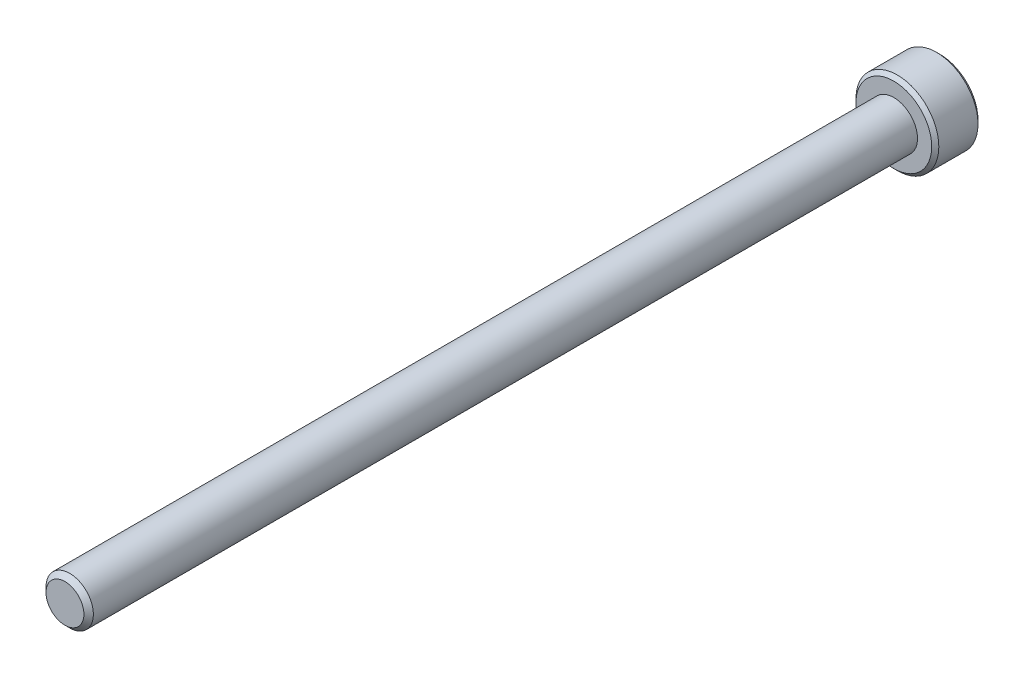
ISO-10303-21;
HEADER;
FILE_DESCRIPTION(('STEP AP214'),'2;1');
FILE_NAME('part.step','',(''),(''),'','','');
FILE_SCHEMA(('AUTOMOTIVE_DESIGN { 1 0 10303 214 1 1 1 1 }'));
ENDSEC;
DATA;
#1=APPLICATION_CONTEXT('core data for automotive mechanical design processes');
#2=APPLICATION_PROTOCOL_DEFINITION('international standard','automotive_design',2000,#1);
#3=PRODUCT_CONTEXT('',#1,'mechanical');
#4=PRODUCT('Part','Part','',(#3));
#5=PRODUCT_RELATED_PRODUCT_CATEGORY('part','',(#4));
#6=PRODUCT_DEFINITION_FORMATION('','',#4);
#7=PRODUCT_DEFINITION_CONTEXT('part definition',#1,'design');
#8=PRODUCT_DEFINITION('design','',#6,#7);
#9=PRODUCT_DEFINITION_SHAPE('','',#8);
#10=(LENGTH_UNIT() NAMED_UNIT(*) SI_UNIT(.MILLI.,.METRE.));
#11=(NAMED_UNIT(*) PLANE_ANGLE_UNIT() SI_UNIT($,.RADIAN.));
#12=(NAMED_UNIT(*) SI_UNIT($,.STERADIAN.) SOLID_ANGLE_UNIT());
#13=UNCERTAINTY_MEASURE_WITH_UNIT(LENGTH_MEASURE(1.E-05),#10,'distance_accuracy_value','');
#14=(GEOMETRIC_REPRESENTATION_CONTEXT(3) GLOBAL_UNCERTAINTY_ASSIGNED_CONTEXT((#13)) GLOBAL_UNIT_ASSIGNED_CONTEXT((#10,
#11,#12)) REPRESENTATION_CONTEXT('',''));
#15=CARTESIAN_POINT('',(0.,0.,0.));
#16=DIRECTION('',(0.,0.,1.));
#17=DIRECTION('',(1.,0.,0.));
#18=AXIS2_PLACEMENT_3D('',#15,#16,#17);
#19=CARTESIAN_POINT('',(0.,0.,3.91));
#20=DIRECTION('',(0.,0.,-1.));
#21=DIRECTION('',(-1.,0.,0.));
#22=AXIS2_PLACEMENT_3D('',#19,#20,#21);
#23=CYLINDRICAL_SURFACE('',#22,3.5);
#24=CARTESIAN_POINT('',(0.,0.,3.61));
#25=DIRECTION('',(0.,0.,1.));
#26=DIRECTION('',(1.,0.,0.));
#27=AXIS2_PLACEMENT_3D('',#24,#25,#26);
#28=CIRCLE('',#27,3.5);
#29=CARTESIAN_POINT('',(3.5,0.,3.61));
#30=VERTEX_POINT('',#29);
#31=EDGE_CURVE('E46',#30,#30,#28,.F.);
#32=ORIENTED_EDGE('',*,*,#31,.T.);
#33=EDGE_LOOP('',(#32));
#34=FACE_BOUND('',#33,.T.);
#35=CARTESIAN_POINT('',(0.,0.,0.300000000000008));
#36=DIRECTION('',(0.,0.,1.));
#37=DIRECTION('',(1.,0.,0.));
#38=AXIS2_PLACEMENT_3D('',#35,#36,#37);
#39=CIRCLE('',#38,3.5);
#40=CARTESIAN_POINT('',(3.5,0.,0.300000000000008));
#41=VERTEX_POINT('',#40);
#42=EDGE_CURVE('E157',#41,#41,#39,.T.);
#43=ORIENTED_EDGE('',*,*,#42,.T.);
#44=EDGE_LOOP('',(#43));
#45=FACE_BOUND('',#44,.T.);
#46=ADVANCED_FACE('F37',(#34,#45),#23,.T.);
#47=CARTESIAN_POINT('',(0.,0.,3.91));
#48=DIRECTION('',(0.,0.,1.));
#49=DIRECTION('',(1.,0.,0.));
#50=AXIS2_PLACEMENT_3D('',#47,#48,#49);
#51=PLANE('',#50);
#52=CARTESIAN_POINT('',(0.,0.,3.91));
#53=DIRECTION('',(0.,0.,1.));
#54=DIRECTION('',(1.,0.,0.));
#55=AXIS2_PLACEMENT_3D('',#52,#53,#54);
#56=CIRCLE('',#55,3.2);
#57=CARTESIAN_POINT('',(3.2,0.,3.91));
#58=VERTEX_POINT('',#57);
#59=EDGE_CURVE('E154',#58,#58,#56,.T.);
#60=ORIENTED_EDGE('',*,*,#59,.T.);
#61=EDGE_LOOP('',(#60));
#62=FACE_BOUND('',#61,.T.);
#63=CARTESIAN_POINT('',(0.,0.,3.91));
#64=DIRECTION('',(0.,0.,1.));
#65=DIRECTION('',(1.,0.,0.));
#66=AXIS2_PLACEMENT_3D('',#63,#64,#65);
#67=CIRCLE('',#66,2.);
#68=CARTESIAN_POINT('',(2.,0.,3.91));
#69=VERTEX_POINT('',#68);
#70=EDGE_CURVE('E140',#69,#69,#67,.T.);
#71=ORIENTED_EDGE('',*,*,#70,.F.);
#72=EDGE_LOOP('',(#71));
#73=FACE_BOUND('',#72,.T.);
#74=ADVANCED_FACE('F170',(#62,#73),#51,.T.);
#75=CARTESIAN_POINT('',(0.,0.,0.));
#76=DIRECTION('',(0.,0.,1.));
#77=DIRECTION('',(1.,0.,0.));
#78=AXIS2_PLACEMENT_3D('',#75,#76,#77);
#79=PLANE('',#78);
#80=CARTESIAN_POINT('',(0.,0.,0.));
#81=DIRECTION('',(0.,0.,1.));
#82=DIRECTION('',(1.,0.,0.));
#83=AXIS2_PLACEMENT_3D('',#80,#81,#82);
#84=CIRCLE('',#83,3.19999999999999);
#85=CARTESIAN_POINT('',(3.19999999999999,0.,0.));
#86=VERTEX_POINT('',#85);
#87=EDGE_CURVE('E11',#86,#86,#84,.F.);
#88=ORIENTED_EDGE('',*,*,#87,.T.);
#89=EDGE_LOOP('',(#88));
#90=FACE_BOUND('',#89,.T.);
#91=DIRECTION('',(0.866025403784439,-0.5,0.));
#92=VECTOR('',#91,1.);
#93=CARTESIAN_POINT('',(0.,1.76091832102836,0.));
#94=LINE('',#93,#92);
#95=CARTESIAN_POINT('',(0.,1.76091832102836,0.));
#96=VERTEX_POINT('',#95);
#97=CARTESIAN_POINT('',(1.525,0.88045916051418,0.));
#98=VERTEX_POINT('',#97);
#99=EDGE_CURVE('E127',#96,#98,#94,.T.);
#100=ORIENTED_EDGE('',*,*,#99,.F.);
#101=DIRECTION('',(0.866025403784439,0.5,0.));
#102=VECTOR('',#101,1.);
#103=CARTESIAN_POINT('',(-1.525,0.880459160514179,0.));
#104=LINE('',#103,#102);
#105=CARTESIAN_POINT('',(-1.525,0.880459160514179,0.));
#106=VERTEX_POINT('',#105);
#107=EDGE_CURVE('E53',#106,#96,#104,.T.);
#108=ORIENTED_EDGE('',*,*,#107,.F.);
#109=DIRECTION('',(0.,1.,0.));
#110=VECTOR('',#109,1.);
#111=CARTESIAN_POINT('',(-1.525,-0.88045916051418,0.));
#112=LINE('',#111,#110);
#113=CARTESIAN_POINT('',(-1.525,-0.88045916051418,0.));
#114=VERTEX_POINT('',#113);
#115=EDGE_CURVE('E136',#114,#106,#112,.T.);
#116=ORIENTED_EDGE('',*,*,#115,.F.);
#117=DIRECTION('',(-0.866025403784439,0.5,0.));
#118=VECTOR('',#117,1.);
#119=CARTESIAN_POINT('',(0.,-1.76091832102836,0.));
#120=LINE('',#119,#118);
#121=CARTESIAN_POINT('',(0.,-1.76091832102836,0.));
#122=VERTEX_POINT('',#121);
#123=EDGE_CURVE('E134',#122,#114,#120,.T.);
#124=ORIENTED_EDGE('',*,*,#123,.F.);
#125=DIRECTION('',(-0.866025403784438,-0.5,0.));
#126=VECTOR('',#125,1.);
#127=CARTESIAN_POINT('',(1.525,-0.880459160514179,0.));
#128=LINE('',#127,#126);
#129=CARTESIAN_POINT('',(1.525,-0.880459160514179,0.));
#130=VERTEX_POINT('',#129);
#131=EDGE_CURVE('E101',#130,#122,#128,.T.);
#132=ORIENTED_EDGE('',*,*,#131,.F.);
#133=DIRECTION('',(0.,-1.,0.));
#134=VECTOR('',#133,1.);
#135=CARTESIAN_POINT('',(1.525,0.88045916051418,0.));
#136=LINE('',#135,#134);
#137=EDGE_CURVE('E130',#98,#130,#136,.T.);
#138=ORIENTED_EDGE('',*,*,#137,.F.);
#139=EDGE_LOOP('',(#100,#108,#116,#124,#132,#138));
#140=FACE_BOUND('',#139,.T.);
#141=ADVANCED_FACE('F173',(#90,#140),#79,.F.);
#142=CARTESIAN_POINT('',(0.,0.,73.91));
#143=DIRECTION('',(0.,0.,-1.));
#144=DIRECTION('',(-1.,0.,0.));
#145=AXIS2_PLACEMENT_3D('',#142,#143,#144);
#146=CYLINDRICAL_SURFACE('',#145,2.);
#147=CARTESIAN_POINT('',(0.,0.,73.51));
#148=DIRECTION('',(0.,0.,1.));
#149=DIRECTION('',(1.,0.,0.));
#150=AXIS2_PLACEMENT_3D('',#147,#148,#149);
#151=CIRCLE('',#150,2.);
#152=CARTESIAN_POINT('',(2.,0.,73.51));
#153=VERTEX_POINT('',#152);
#154=EDGE_CURVE('E151',#153,#153,#151,.F.);
#155=ORIENTED_EDGE('',*,*,#154,.T.);
#156=EDGE_LOOP('',(#155));
#157=FACE_BOUND('',#156,.T.);
#158=ORIENTED_EDGE('',*,*,#70,.T.);
#159=EDGE_LOOP('',(#158));
#160=FACE_BOUND('',#159,.T.);
#161=ADVANCED_FACE('F177',(#157,#160),#146,.T.);
#162=CARTESIAN_POINT('',(0.,0.,73.91));
#163=DIRECTION('',(0.,0.,1.));
#164=DIRECTION('',(1.,0.,0.));
#165=AXIS2_PLACEMENT_3D('',#162,#163,#164);
#166=PLANE('',#165);
#167=CARTESIAN_POINT('',(0.,0.,73.91));
#168=DIRECTION('',(0.,0.,1.));
#169=DIRECTION('',(1.,0.,0.));
#170=AXIS2_PLACEMENT_3D('',#167,#168,#169);
#171=CIRCLE('',#170,1.6);
#172=CARTESIAN_POINT('',(1.6,0.,73.91));
#173=VERTEX_POINT('',#172);
#174=EDGE_CURVE('E148',#173,#173,#171,.T.);
#175=ORIENTED_EDGE('',*,*,#174,.T.);
#176=EDGE_LOOP('',(#175));
#177=FACE_BOUND('',#176,.T.);
#178=ADVANCED_FACE('F179',(#177),#166,.T.);
#179=CARTESIAN_POINT('',(-1.525,0.880459160514179,2.));
#180=DIRECTION('',(-0.5,0.866025403784439,0.));
#181=DIRECTION('',(-0.866025403784439,-0.5,0.));
#182=AXIS2_PLACEMENT_3D('',#179,#180,#181);
#183=PLANE('',#182);
#184=ORIENTED_EDGE('',*,*,#107,.T.);
#185=DIRECTION('',(0.,0.,-1.));
#186=VECTOR('',#185,1.);
#187=CARTESIAN_POINT('',(0.,1.76091832102836,2.));
#188=LINE('',#187,#186);
#189=CARTESIAN_POINT('',(0.,1.76091832102836,2.));
#190=VERTEX_POINT('',#189);
#191=EDGE_CURVE('E83',#190,#96,#188,.T.);
#192=ORIENTED_EDGE('',*,*,#191,.F.);
#193=DIRECTION('',(0.866025403784439,0.5,0.));
#194=VECTOR('',#193,1.);
#195=CARTESIAN_POINT('',(-1.525,0.880459160514179,2.));
#196=LINE('',#195,#194);
#197=CARTESIAN_POINT('',(-1.525,0.880459160514179,2.));
#198=VERTEX_POINT('',#197);
#199=EDGE_CURVE('E138',#198,#190,#196,.T.);
#200=ORIENTED_EDGE('',*,*,#199,.F.);
#201=DIRECTION('',(0.,0.,-1.));
#202=VECTOR('',#201,1.);
#203=CARTESIAN_POINT('',(-1.525,0.880459160514179,2.));
#204=LINE('',#203,#202);
#205=EDGE_CURVE('E61',#198,#106,#204,.T.);
#206=ORIENTED_EDGE('',*,*,#205,.T.);
#207=EDGE_LOOP('',(#184,#192,#200,#206));
#208=FACE_BOUND('',#207,.T.);
#209=ADVANCED_FACE('F186',(#208),#183,.F.);
#210=CARTESIAN_POINT('',(-1.525,-0.88045916051418,2.));
#211=DIRECTION('',(-1.,0.,0.));
#212=DIRECTION('',(0.,0.,1.));
#213=AXIS2_PLACEMENT_3D('',#210,#211,#212);
#214=PLANE('',#213);
#215=ORIENTED_EDGE('',*,*,#115,.T.);
#216=ORIENTED_EDGE('',*,*,#205,.F.);
#217=DIRECTION('',(0.,1.,0.));
#218=VECTOR('',#217,1.);
#219=CARTESIAN_POINT('',(-1.525,-0.88045916051418,2.));
#220=LINE('',#219,#218);
#221=CARTESIAN_POINT('',(-1.525,-0.88045916051418,2.));
#222=VERTEX_POINT('',#221);
#223=EDGE_CURVE('E113',#222,#198,#220,.T.);
#224=ORIENTED_EDGE('',*,*,#223,.F.);
#225=DIRECTION('',(0.,0.,-1.));
#226=VECTOR('',#225,1.);
#227=CARTESIAN_POINT('',(-1.525,-0.88045916051418,2.));
#228=LINE('',#227,#226);
#229=EDGE_CURVE('E105',#222,#114,#228,.T.);
#230=ORIENTED_EDGE('',*,*,#229,.T.);
#231=EDGE_LOOP('',(#215,#216,#224,#230));
#232=FACE_BOUND('',#231,.T.);
#233=ADVANCED_FACE('F221',(#232),#214,.F.);
#234=CARTESIAN_POINT('',(0.,-1.76091832102836,2.));
#235=DIRECTION('',(-0.5,-0.866025403784439,0.));
#236=DIRECTION('',(0.866025403784439,-0.5,0.));
#237=AXIS2_PLACEMENT_3D('',#234,#235,#236);
#238=PLANE('',#237);
#239=ORIENTED_EDGE('',*,*,#123,.T.);
#240=ORIENTED_EDGE('',*,*,#229,.F.);
#241=DIRECTION('',(-0.866025403784439,0.5,0.));
#242=VECTOR('',#241,1.);
#243=CARTESIAN_POINT('',(0.,-1.76091832102836,2.));
#244=LINE('',#243,#242);
#245=CARTESIAN_POINT('',(0.,-1.76091832102836,2.));
#246=VERTEX_POINT('',#245);
#247=EDGE_CURVE('E109',#246,#222,#244,.T.);
#248=ORIENTED_EDGE('',*,*,#247,.F.);
#249=DIRECTION('',(0.,0.,-1.));
#250=VECTOR('',#249,1.);
#251=CARTESIAN_POINT('',(0.,-1.76091832102836,2.));
#252=LINE('',#251,#250);
#253=EDGE_CURVE('E94',#246,#122,#252,.T.);
#254=ORIENTED_EDGE('',*,*,#253,.T.);
#255=EDGE_LOOP('',(#239,#240,#248,#254));
#256=FACE_BOUND('',#255,.T.);
#257=ADVANCED_FACE('F110',(#256),#238,.F.);
#258=CARTESIAN_POINT('',(1.525,-0.880459160514179,2.));
#259=DIRECTION('',(0.5,-0.866025403784439,0.));
#260=DIRECTION('',(0.866025403784438,0.5,0.));
#261=AXIS2_PLACEMENT_3D('',#258,#259,#260);
#262=PLANE('',#261);
#263=ORIENTED_EDGE('',*,*,#131,.T.);
#264=ORIENTED_EDGE('',*,*,#253,.F.);
#265=DIRECTION('',(-0.866025403784438,-0.5,0.));
#266=VECTOR('',#265,1.);
#267=CARTESIAN_POINT('',(1.525,-0.880459160514179,2.));
#268=LINE('',#267,#266);
#269=CARTESIAN_POINT('',(1.525,-0.880459160514179,2.));
#270=VERTEX_POINT('',#269);
#271=EDGE_CURVE('E98',#270,#246,#268,.T.);
#272=ORIENTED_EDGE('',*,*,#271,.F.);
#273=DIRECTION('',(0.,0.,-1.));
#274=VECTOR('',#273,1.);
#275=CARTESIAN_POINT('',(1.525,-0.880459160514179,2.));
#276=LINE('',#275,#274);
#277=EDGE_CURVE('E106',#270,#130,#276,.T.);
#278=ORIENTED_EDGE('',*,*,#277,.T.);
#279=EDGE_LOOP('',(#263,#264,#272,#278));
#280=FACE_BOUND('',#279,.T.);
#281=ADVANCED_FACE('F96',(#280),#262,.F.);
#282=CARTESIAN_POINT('',(1.525,0.88045916051418,2.));
#283=DIRECTION('',(1.,0.,0.));
#284=DIRECTION('',(0.,0.,-1.));
#285=AXIS2_PLACEMENT_3D('',#282,#283,#284);
#286=PLANE('',#285);
#287=ORIENTED_EDGE('',*,*,#137,.T.);
#288=ORIENTED_EDGE('',*,*,#277,.F.);
#289=DIRECTION('',(0.,-1.,0.));
#290=VECTOR('',#289,1.);
#291=CARTESIAN_POINT('',(1.525,0.88045916051418,2.));
#292=LINE('',#291,#290);
#293=CARTESIAN_POINT('',(1.525,0.88045916051418,2.));
#294=VERTEX_POINT('',#293);
#295=EDGE_CURVE('E119',#294,#270,#292,.T.);
#296=ORIENTED_EDGE('',*,*,#295,.F.);
#297=DIRECTION('',(0.,0.,-1.));
#298=VECTOR('',#297,1.);
#299=CARTESIAN_POINT('',(1.525,0.88045916051418,2.));
#300=LINE('',#299,#298);
#301=EDGE_CURVE('E143',#294,#98,#300,.T.);
#302=ORIENTED_EDGE('',*,*,#301,.T.);
#303=EDGE_LOOP('',(#287,#288,#296,#302));
#304=FACE_BOUND('',#303,.T.);
#305=ADVANCED_FACE('F217',(#304),#286,.F.);
#306=CARTESIAN_POINT('',(0.,1.76091832102836,2.));
#307=DIRECTION('',(0.5,0.866025403784439,0.));
#308=DIRECTION('',(-0.866025403784439,0.5,0.));
#309=AXIS2_PLACEMENT_3D('',#306,#307,#308);
#310=PLANE('',#309);
#311=ORIENTED_EDGE('',*,*,#99,.T.);
#312=ORIENTED_EDGE('',*,*,#301,.F.);
#313=DIRECTION('',(0.866025403784439,-0.5,0.));
#314=VECTOR('',#313,1.);
#315=CARTESIAN_POINT('',(0.,1.76091832102836,2.));
#316=LINE('',#315,#314);
#317=EDGE_CURVE('E121',#190,#294,#316,.T.);
#318=ORIENTED_EDGE('',*,*,#317,.F.);
#319=ORIENTED_EDGE('',*,*,#191,.T.);
#320=EDGE_LOOP('',(#311,#312,#318,#319));
#321=FACE_BOUND('',#320,.T.);
#322=ADVANCED_FACE('F209',(#321),#310,.F.);
#323=CARTESIAN_POINT('',(0.,0.,2.));
#324=DIRECTION('',(0.,0.,-1.));
#325=DIRECTION('',(-1.,0.,0.));
#326=AXIS2_PLACEMENT_3D('',#323,#324,#325);
#327=PLANE('',#326);
#328=ORIENTED_EDGE('',*,*,#199,.T.);
#329=ORIENTED_EDGE('',*,*,#317,.T.);
#330=ORIENTED_EDGE('',*,*,#295,.T.);
#331=ORIENTED_EDGE('',*,*,#271,.T.);
#332=ORIENTED_EDGE('',*,*,#247,.T.);
#333=ORIENTED_EDGE('',*,*,#223,.T.);
#334=EDGE_LOOP('',(#328,#329,#330,#331,#332,#333));
#335=FACE_BOUND('',#334,.T.);
#336=ADVANCED_FACE('F116',(#335),#327,.T.);
#337=CARTESIAN_POINT('',(0.,0.,73.91));
#338=DIRECTION('',(0.,0.,-1.));
#339=DIRECTION('',(-1.,0.,0.));
#340=AXIS2_PLACEMENT_3D('',#337,#338,#339);
#341=CONICAL_SURFACE('',#340,1.6,0.785398163397463);
#342=ORIENTED_EDGE('',*,*,#154,.F.);
#343=EDGE_LOOP('',(#342));
#344=FACE_BOUND('',#343,.T.);
#345=ORIENTED_EDGE('',*,*,#174,.F.);
#346=EDGE_LOOP('',(#345));
#347=FACE_BOUND('',#346,.T.);
#348=ADVANCED_FACE('F167',(#344,#347),#341,.T.);
#349=CARTESIAN_POINT('',(0.,0.,3.91));
#350=DIRECTION('',(0.,0.,-1.));
#351=DIRECTION('',(-1.,0.,0.));
#352=AXIS2_PLACEMENT_3D('',#349,#350,#351);
#353=CONICAL_SURFACE('',#352,3.2,0.785398163397447);
#354=ORIENTED_EDGE('',*,*,#31,.F.);
#355=EDGE_LOOP('',(#354));
#356=FACE_BOUND('',#355,.T.);
#357=ORIENTED_EDGE('',*,*,#59,.F.);
#358=EDGE_LOOP('',(#357));
#359=FACE_BOUND('',#358,.T.);
#360=ADVANCED_FACE('F164',(#356,#359),#353,.T.);
#361=CARTESIAN_POINT('',(0.,0.,0.300000000000008));
#362=DIRECTION('',(0.,0.,1.));
#363=DIRECTION('',(1.,0.,0.));
#364=AXIS2_PLACEMENT_3D('',#361,#362,#363);
#365=CONICAL_SURFACE('',#364,3.5,0.785398163397457);
#366=ORIENTED_EDGE('',*,*,#87,.F.);
#367=EDGE_LOOP('',(#366));
#368=FACE_BOUND('',#367,.T.);
#369=ORIENTED_EDGE('',*,*,#42,.F.);
#370=EDGE_LOOP('',(#369));
#371=FACE_BOUND('',#370,.T.);
#372=ADVANCED_FACE('F40',(#368,#371),#365,.T.);
#373=CLOSED_SHELL('',(#46,#74,#141,#161,#178,#209,#233,#257,#281,#305,#322,#336,#348,#360,#372));
#374=MANIFOLD_SOLID_BREP('B2',#373);
#375=ADVANCED_BREP_SHAPE_REPRESENTATION('',(#18,#374),#14);
#376=SHAPE_DEFINITION_REPRESENTATION(#9,#375);
ENDSEC;
END-ISO-10303-21;
